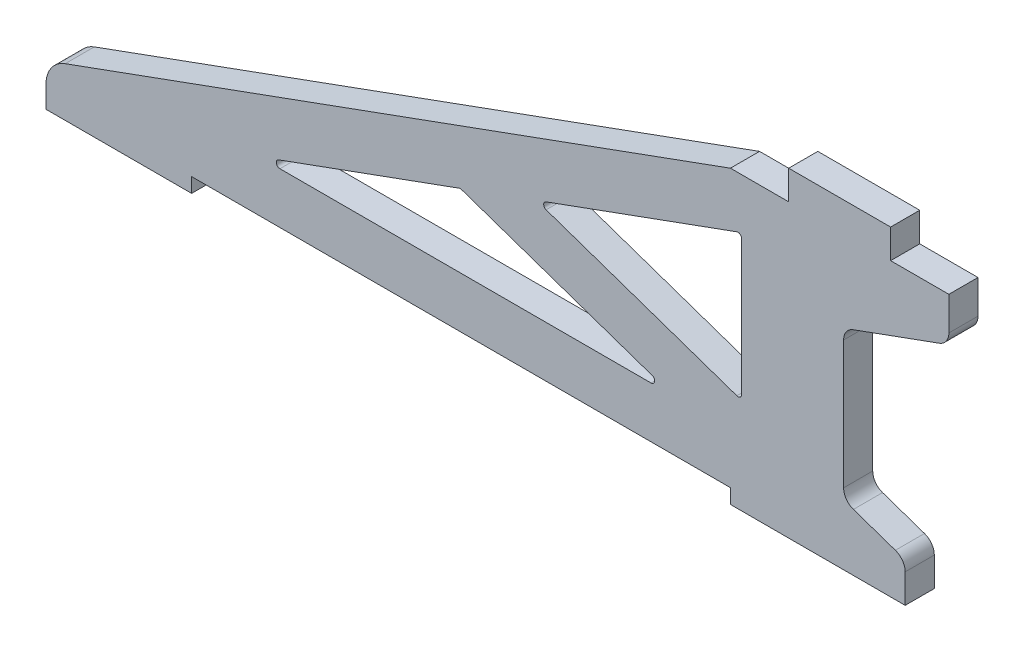
ISO-10303-21;
HEADER;
FILE_DESCRIPTION(('STEP AP214'),'2;1');
FILE_NAME('part.step','',(''),(''),'','','');
FILE_SCHEMA(('AUTOMOTIVE_DESIGN { 1 0 10303 214 1 1 1 1 }'));
ENDSEC;
DATA;
#1=APPLICATION_CONTEXT('core data for automotive mechanical design processes');
#2=APPLICATION_PROTOCOL_DEFINITION('international standard','automotive_design',2000,#1);
#3=PRODUCT_CONTEXT('',#1,'mechanical');
#4=PRODUCT('Part','Part','',(#3));
#5=PRODUCT_RELATED_PRODUCT_CATEGORY('part','',(#4));
#6=PRODUCT_DEFINITION_FORMATION('','',#4);
#7=PRODUCT_DEFINITION_CONTEXT('part definition',#1,'design');
#8=PRODUCT_DEFINITION('design','',#6,#7);
#9=PRODUCT_DEFINITION_SHAPE('','',#8);
#10=(LENGTH_UNIT() NAMED_UNIT(*) SI_UNIT(.MILLI.,.METRE.));
#11=(NAMED_UNIT(*) PLANE_ANGLE_UNIT() SI_UNIT($,.RADIAN.));
#12=(NAMED_UNIT(*) SI_UNIT($,.STERADIAN.) SOLID_ANGLE_UNIT());
#13=UNCERTAINTY_MEASURE_WITH_UNIT(LENGTH_MEASURE(1.E-05),#10,'distance_accuracy_value','');
#14=(GEOMETRIC_REPRESENTATION_CONTEXT(3) GLOBAL_UNCERTAINTY_ASSIGNED_CONTEXT((#13)) GLOBAL_UNIT_ASSIGNED_CONTEXT((#10,
#11,#12)) REPRESENTATION_CONTEXT('',''));
#15=CARTESIAN_POINT('',(0.,0.,0.));
#16=DIRECTION('',(0.,0.,1.));
#17=DIRECTION('',(1.,0.,0.));
#18=AXIS2_PLACEMENT_3D('',#15,#16,#17);
#19=CARTESIAN_POINT('',(61.,17.7002075382097,2.));
#20=DIRECTION('',(0.,0.,-1.));
#21=DIRECTION('',(-1.,0.,0.));
#22=AXIS2_PLACEMENT_3D('',#19,#20,#21);
#23=PLANE('',#22);
#24=CARTESIAN_POINT('',(47.5209644446334,16.1989489041729,2.));
#25=DIRECTION('',(0.,0.,1.));
#26=DIRECTION('',(1.,0.,0.));
#27=AXIS2_PLACEMENT_3D('',#24,#25,#26);
#28=CIRCLE('',#27,0.250000000000001);
#29=CARTESIAN_POINT('',(47.7709644446334,16.1989489041729,2.));
#30=VERTEX_POINT('',#29);
#31=CARTESIAN_POINT('',(47.435459408802,16.4338720593694,2.));
#32=VERTEX_POINT('',#31);
#33=EDGE_CURVE('E304',#30,#32,#28,.T.);
#34=ORIENTED_EDGE('',*,*,#33,.F.);
#35=DIRECTION('',(0.,1.,0.));
#36=VECTOR('',#35,1.);
#37=CARTESIAN_POINT('',(47.7709644446334,16.1989489041729,2.));
#38=LINE('',#37,#36);
#39=CARTESIAN_POINT('',(47.7709644446334,6.92390154960729,2.));
#40=VERTEX_POINT('',#39);
#41=EDGE_CURVE('E316',#40,#30,#38,.T.);
#42=ORIENTED_EDGE('',*,*,#41,.F.);
#43=CARTESIAN_POINT('',(47.5209644446334,6.92390154960729,2.));
#44=DIRECTION('',(0.,0.,1.));
#45=DIRECTION('',(-1.,0.,0.));
#46=AXIS2_PLACEMENT_3D('',#43,#44,#45);
#47=CIRCLE('',#46,0.249999999999999);
#48=CARTESIAN_POINT('',(47.4395724060191,6.68752190570746,2.));
#49=VERTEX_POINT('',#48);
#50=EDGE_CURVE('E313',#49,#40,#47,.T.);
#51=ORIENTED_EDGE('',*,*,#50,.F.);
#52=DIRECTION('',(0.945518575599319,-0.32556815445715,0.));
#53=VECTOR('',#52,1.);
#54=CARTESIAN_POINT('',(47.4395724060191,6.68752190570746,2.));
#55=LINE('',#54,#53);
#56=CARTESIAN_POINT('',(34.34473188579,11.1964370884466,2.));
#57=VERTEX_POINT('',#56);
#58=EDGE_CURVE('E311',#57,#49,#55,.T.);
#59=ORIENTED_EDGE('',*,*,#58,.F.);
#60=CARTESIAN_POINT('',(34.4261239244043,11.4328167323465,2.));
#61=DIRECTION('',(0.,0.,1.));
#62=DIRECTION('',(-1.,0.,0.));
#63=AXIS2_PLACEMENT_3D('',#60,#61,#62);
#64=CIRCLE('',#63,0.249999999999997);
#65=CARTESIAN_POINT('',(34.3406188885729,11.6677398875429,2.));
#66=VERTEX_POINT('',#65);
#67=EDGE_CURVE('E309',#66,#57,#64,.T.);
#68=ORIENTED_EDGE('',*,*,#67,.F.);
#69=DIRECTION('',(-0.939692620785906,-0.342020143325677,0.));
#70=VECTOR('',#69,1.);
#71=CARTESIAN_POINT('',(34.3406188885729,11.6677398875429,2.));
#72=LINE('',#71,#70);
#73=EDGE_CURVE('E306',#32,#66,#72,.T.);
#74=ORIENTED_EDGE('',*,*,#73,.F.);
#75=EDGE_LOOP('',(#34,#42,#51,#59,#68,#74));
#76=FACE_BOUND('',#75,.T.);
#77=DIRECTION('',(-1.,0.,0.));
#78=VECTOR('',#77,1.);
#79=CARTESIAN_POINT('',(47.,20.,2.));
#80=LINE('',#79,#78);
#81=CARTESIAN_POINT('',(51.,20.,2.));
#82=VERTEX_POINT('',#81);
#83=CARTESIAN_POINT('',(47.,20.,2.));
#84=VERTEX_POINT('',#83);
#85=EDGE_CURVE('E349',#82,#84,#80,.T.);
#86=ORIENTED_EDGE('',*,*,#85,.T.);
#87=DIRECTION('',(-0.939692620785906,-0.342020143325676,0.));
#88=VECTOR('',#87,1.);
#89=CARTESIAN_POINT('',(1.31595971334865,3.37236915464047,2.));
#90=LINE('',#89,#88);
#91=CARTESIAN_POINT('',(1.31595971334865,3.37236915464047,2.));
#92=VERTEX_POINT('',#91);
#93=EDGE_CURVE('E352',#84,#92,#90,.T.);
#94=ORIENTED_EDGE('',*,*,#93,.T.);
#95=CARTESIAN_POINT('',(2.,1.49298391306866,2.));
#96=DIRECTION('',(0.,0.,1.));
#97=DIRECTION('',(1.,0.,0.));
#98=AXIS2_PLACEMENT_3D('',#95,#96,#97);
#99=CIRCLE('',#98,2.);
#100=CARTESIAN_POINT('',(0.,1.49298391306866,2.));
#101=VERTEX_POINT('',#100);
#102=EDGE_CURVE('E355',#92,#101,#99,.T.);
#103=ORIENTED_EDGE('',*,*,#102,.T.);
#104=DIRECTION('',(0.,-1.,0.));
#105=VECTOR('',#104,1.);
#106=CARTESIAN_POINT('',(0.,1.49298391306866,2.));
#107=LINE('',#106,#105);
#108=CARTESIAN_POINT('',(0.,0.,2.));
#109=VERTEX_POINT('',#108);
#110=EDGE_CURVE('E357',#101,#109,#107,.T.);
#111=ORIENTED_EDGE('',*,*,#110,.T.);
#112=DIRECTION('',(1.,0.,0.));
#113=VECTOR('',#112,1.);
#114=CARTESIAN_POINT('',(10.,0.,2.));
#115=LINE('',#114,#113);
#116=CARTESIAN_POINT('',(10.,0.,2.));
#117=VERTEX_POINT('',#116);
#118=EDGE_CURVE('E359',#109,#117,#115,.T.);
#119=ORIENTED_EDGE('',*,*,#118,.T.);
#120=DIRECTION('',(0.,1.,0.));
#121=VECTOR('',#120,1.);
#122=CARTESIAN_POINT('',(10.,1.,2.));
#123=LINE('',#122,#121);
#124=CARTESIAN_POINT('',(10.,1.,2.));
#125=VERTEX_POINT('',#124);
#126=EDGE_CURVE('E361',#117,#125,#123,.T.);
#127=ORIENTED_EDGE('',*,*,#126,.T.);
#128=DIRECTION('',(1.,0.,0.));
#129=VECTOR('',#128,1.);
#130=CARTESIAN_POINT('',(47.,1.00000000000001,2.));
#131=LINE('',#130,#129);
#132=CARTESIAN_POINT('',(47.,1.00000000000001,2.));
#133=VERTEX_POINT('',#132);
#134=EDGE_CURVE('E363',#125,#133,#131,.T.);
#135=ORIENTED_EDGE('',*,*,#134,.T.);
#136=DIRECTION('',(0.,-1.,0.));
#137=VECTOR('',#136,1.);
#138=CARTESIAN_POINT('',(47.,0.,2.));
#139=LINE('',#138,#137);
#140=CARTESIAN_POINT('',(47.,0.,2.));
#141=VERTEX_POINT('',#140);
#142=EDGE_CURVE('E365',#133,#141,#139,.T.);
#143=ORIENTED_EDGE('',*,*,#142,.T.);
#144=DIRECTION('',(1.,0.,0.));
#145=VECTOR('',#144,1.);
#146=CARTESIAN_POINT('',(59.,0.,2.));
#147=LINE('',#146,#145);
#148=CARTESIAN_POINT('',(59.,0.,2.));
#149=VERTEX_POINT('',#148);
#150=EDGE_CURVE('E367',#141,#149,#147,.T.);
#151=ORIENTED_EDGE('',*,*,#150,.T.);
#152=DIRECTION('',(0.,1.,0.));
#153=VECTOR('',#152,1.);
#154=CARTESIAN_POINT('',(59.,1.99365439576711,2.));
#155=LINE('',#154,#153);
#156=CARTESIAN_POINT('',(59.,1.99365439576711,2.));
#157=VERTEX_POINT('',#156);
#158=EDGE_CURVE('E369',#149,#157,#155,.T.);
#159=ORIENTED_EDGE('',*,*,#158,.T.);
#160=CARTESIAN_POINT('',(58.,1.99365439576711,2.));
#161=DIRECTION('',(0.,0.,1.));
#162=DIRECTION('',(-1.,0.,0.));
#163=AXIS2_PLACEMENT_3D('',#160,#161,#162);
#164=CIRCLE('',#163,0.999999999999998);
#165=CARTESIAN_POINT('',(58.3255681544571,2.93917297136643,2.));
#166=VERTEX_POINT('',#165);
#167=EDGE_CURVE('E371',#157,#166,#164,.T.);
#168=ORIENTED_EDGE('',*,*,#167,.T.);
#169=DIRECTION('',(-0.945518575599319,0.325568154457152,0.));
#170=VECTOR('',#169,1.);
#171=CARTESIAN_POINT('',(55.4453962901762,3.9308956752583,2.));
#172=LINE('',#171,#170);
#173=CARTESIAN_POINT('',(55.4453962901762,3.9308956752583,2.));
#174=VERTEX_POINT('',#173);
#175=EDGE_CURVE('E373',#166,#174,#172,.T.);
#176=ORIENTED_EDGE('',*,*,#175,.T.);
#177=CARTESIAN_POINT('',(55.7709644446334,4.87641425085762,2.));
#178=DIRECTION('',(0.,0.,-1.));
#179=DIRECTION('',(1.,0.,0.));
#180=AXIS2_PLACEMENT_3D('',#177,#178,#179);
#181=CIRCLE('',#180,0.999999999999999);
#182=CARTESIAN_POINT('',(54.7709644446334,4.87641425085762,2.));
#183=VERTEX_POINT('',#182);
#184=EDGE_CURVE('E375',#174,#183,#181,.T.);
#185=ORIENTED_EDGE('',*,*,#184,.T.);
#186=DIRECTION('',(0.,1.,0.));
#187=VECTOR('',#186,1.);
#188=CARTESIAN_POINT('',(54.7709644446334,13.6686386971847,2.));
#189=LINE('',#188,#187);
#190=CARTESIAN_POINT('',(54.7709644446334,13.6686386971847,2.));
#191=VERTEX_POINT('',#190);
#192=EDGE_CURVE('E377',#183,#191,#189,.T.);
#193=ORIENTED_EDGE('',*,*,#192,.T.);
#194=CARTESIAN_POINT('',(55.7709644446334,13.6686386971847,2.));
#195=DIRECTION('',(0.,0.,-1.));
#196=DIRECTION('',(1.,0.,0.));
#197=AXIS2_PLACEMENT_3D('',#194,#195,#196);
#198=CIRCLE('',#197,1.);
#199=CARTESIAN_POINT('',(55.4289443013077,14.6083313179707,2.));
#200=VERTEX_POINT('',#199);
#201=EDGE_CURVE('E379',#191,#200,#198,.T.);
#202=ORIENTED_EDGE('',*,*,#201,.T.);
#203=DIRECTION('',(0.939692620785905,0.342020143325677,0.));
#204=VECTOR('',#203,1.);
#205=CARTESIAN_POINT('',(61.3420201433257,16.7605149174238,2.));
#206=LINE('',#205,#204);
#207=CARTESIAN_POINT('',(61.3420201433257,16.7605149174238,2.));
#208=VERTEX_POINT('',#207);
#209=EDGE_CURVE('E381',#200,#208,#206,.T.);
#210=ORIENTED_EDGE('',*,*,#209,.T.);
#211=CARTESIAN_POINT('',(61.,17.7002075382097,2.));
#212=DIRECTION('',(0.,0.,1.));
#213=DIRECTION('',(-1.,0.,0.));
#214=AXIS2_PLACEMENT_3D('',#211,#212,#213);
#215=CIRCLE('',#214,1.);
#216=CARTESIAN_POINT('',(62.,17.7002075382097,2.));
#217=VERTEX_POINT('',#216);
#218=EDGE_CURVE('E383',#208,#217,#215,.T.);
#219=ORIENTED_EDGE('',*,*,#218,.T.);
#220=DIRECTION('',(0.,1.,0.));
#221=VECTOR('',#220,1.);
#222=CARTESIAN_POINT('',(62.,20.,2.));
#223=LINE('',#222,#221);
#224=CARTESIAN_POINT('',(62.,20.,2.));
#225=VERTEX_POINT('',#224);
#226=EDGE_CURVE('E385',#217,#225,#223,.T.);
#227=ORIENTED_EDGE('',*,*,#226,.T.);
#228=DIRECTION('',(-1.,0.,0.));
#229=VECTOR('',#228,1.);
#230=CARTESIAN_POINT('',(58.,20.,2.));
#231=LINE('',#230,#229);
#232=CARTESIAN_POINT('',(58.,20.,2.));
#233=VERTEX_POINT('',#232);
#234=EDGE_CURVE('E387',#225,#233,#231,.T.);
#235=ORIENTED_EDGE('',*,*,#234,.T.);
#236=DIRECTION('',(0.,1.,0.));
#237=VECTOR('',#236,1.);
#238=CARTESIAN_POINT('',(58.,22.,2.));
#239=LINE('',#238,#237);
#240=CARTESIAN_POINT('',(58.,22.,2.));
#241=VERTEX_POINT('',#240);
#242=EDGE_CURVE('E389',#233,#241,#239,.T.);
#243=ORIENTED_EDGE('',*,*,#242,.T.);
#244=DIRECTION('',(-1.,0.,0.));
#245=VECTOR('',#244,1.);
#246=CARTESIAN_POINT('',(51.,22.,2.));
#247=LINE('',#246,#245);
#248=CARTESIAN_POINT('',(51.,22.,2.));
#249=VERTEX_POINT('',#248);
#250=EDGE_CURVE('E391',#241,#249,#247,.T.);
#251=ORIENTED_EDGE('',*,*,#250,.T.);
#252=DIRECTION('',(0.,-1.,0.));
#253=VECTOR('',#252,1.);
#254=CARTESIAN_POINT('',(51.,20.,2.));
#255=LINE('',#254,#253);
#256=EDGE_CURVE('E393',#249,#82,#255,.T.);
#257=ORIENTED_EDGE('',*,*,#256,.T.);
#258=EDGE_LOOP('',(#86,#94,#103,#111,#119,#127,#135,#143,#151,#159,#168,#176,#185,#193,#202,
#210,#219,#227,#235,#243,#251,#257));
#259=FACE_BOUND('',#258,.T.);
#260=CARTESIAN_POINT('',(28.4533785047411,9.25891518273918,2.));
#261=DIRECTION('',(0.,0.,1.));
#262=DIRECTION('',(-1.,0.,0.));
#263=AXIS2_PLACEMENT_3D('',#260,#261,#262);
#264=CIRCLE('',#263,0.249999999999999);
#265=CARTESIAN_POINT('',(28.5347705433553,9.49529482663901,2.));
#266=VERTEX_POINT('',#265);
#267=CARTESIAN_POINT('',(28.3678734689096,9.49383833793565,2.));
#268=VERTEX_POINT('',#267);
#269=EDGE_CURVE('E253',#266,#268,#264,.T.);
#270=ORIENTED_EDGE('',*,*,#269,.F.);
#271=DIRECTION('',(-0.945518575599319,0.32556815445715,0.));
#272=VECTOR('',#271,1.);
#273=CARTESIAN_POINT('',(28.5347705433553,9.49529482663901,2.));
#274=LINE('',#273,#272);
#275=CARTESIAN_POINT('',(41.6296110635844,4.98637964389983,2.));
#276=VERTEX_POINT('',#275);
#277=EDGE_CURVE('E282',#276,#266,#274,.T.);
#278=ORIENTED_EDGE('',*,*,#277,.F.);
#279=CARTESIAN_POINT('',(41.5482190249701,4.75,2.));
#280=DIRECTION('',(0.,0.,1.));
#281=DIRECTION('',(-1.,0.,0.));
#282=AXIS2_PLACEMENT_3D('',#279,#280,#281);
#283=CIRCLE('',#282,0.250000000000002);
#284=CARTESIAN_POINT('',(41.5482190249701,4.5,2.));
#285=VERTEX_POINT('',#284);
#286=EDGE_CURVE('E280',#285,#276,#283,.T.);
#287=ORIENTED_EDGE('',*,*,#286,.F.);
#288=DIRECTION('',(1.,0.,0.));
#289=VECTOR('',#288,1.);
#290=CARTESIAN_POINT('',(41.5482190249701,4.5,2.));
#291=LINE('',#290,#289);
#292=CARTESIAN_POINT('',(16.0652358539294,4.5,2.));
#293=VERTEX_POINT('',#292);
#294=EDGE_CURVE('E276',#293,#285,#291,.T.);
#295=ORIENTED_EDGE('',*,*,#294,.F.);
#296=CARTESIAN_POINT('',(16.0652358539294,4.75,2.));
#297=DIRECTION('',(0.,0.,1.));
#298=DIRECTION('',(1.,0.,0.));
#299=AXIS2_PLACEMENT_3D('',#296,#297,#298);
#300=CIRCLE('',#299,0.250000000000001);
#301=CARTESIAN_POINT('',(15.979730818098,4.98492315519648,2.));
#302=VERTEX_POINT('',#301);
#303=EDGE_CURVE('E274',#302,#293,#300,.T.);
#304=ORIENTED_EDGE('',*,*,#303,.F.);
#305=DIRECTION('',(-0.939692620785906,-0.342020143325676,0.));
#306=VECTOR('',#305,1.);
#307=CARTESIAN_POINT('',(15.979730818098,4.98492315519648,2.));
#308=LINE('',#307,#306);
#309=EDGE_CURVE('E261',#268,#302,#308,.T.);
#310=ORIENTED_EDGE('',*,*,#309,.F.);
#311=EDGE_LOOP('',(#270,#278,#287,#295,#304,#310));
#312=FACE_BOUND('',#311,.T.);
#313=ADVANCED_FACE('F32',(#76,#259,#312),#23,.F.);
#314=CARTESIAN_POINT('',(61.,17.7002075382097,0.));
#315=DIRECTION('',(0.,0.,-1.));
#316=DIRECTION('',(-1.,0.,0.));
#317=AXIS2_PLACEMENT_3D('',#314,#315,#316);
#318=PLANE('',#317);
#319=DIRECTION('',(-1.,0.,0.));
#320=VECTOR('',#319,1.);
#321=CARTESIAN_POINT('',(47.,20.,0.));
#322=LINE('',#321,#320);
#323=CARTESIAN_POINT('',(51.,20.,0.));
#324=VERTEX_POINT('',#323);
#325=CARTESIAN_POINT('',(47.,20.,0.));
#326=VERTEX_POINT('',#325);
#327=EDGE_CURVE('E348',#324,#326,#322,.T.);
#328=ORIENTED_EDGE('',*,*,#327,.F.);
#329=DIRECTION('',(0.,-1.,0.));
#330=VECTOR('',#329,1.);
#331=CARTESIAN_POINT('',(51.,20.,0.));
#332=LINE('',#331,#330);
#333=CARTESIAN_POINT('',(51.,22.,0.));
#334=VERTEX_POINT('',#333);
#335=EDGE_CURVE('E353',#334,#324,#332,.T.);
#336=ORIENTED_EDGE('',*,*,#335,.F.);
#337=DIRECTION('',(-1.,0.,0.));
#338=VECTOR('',#337,1.);
#339=CARTESIAN_POINT('',(51.,22.,0.));
#340=LINE('',#339,#338);
#341=CARTESIAN_POINT('',(58.,22.,0.));
#342=VERTEX_POINT('',#341);
#343=EDGE_CURVE('E436',#342,#334,#340,.T.);
#344=ORIENTED_EDGE('',*,*,#343,.F.);
#345=DIRECTION('',(0.,1.,0.));
#346=VECTOR('',#345,1.);
#347=CARTESIAN_POINT('',(58.,22.,0.));
#348=LINE('',#347,#346);
#349=CARTESIAN_POINT('',(58.,20.,0.));
#350=VERTEX_POINT('',#349);
#351=EDGE_CURVE('E434',#350,#342,#348,.T.);
#352=ORIENTED_EDGE('',*,*,#351,.F.);
#353=DIRECTION('',(-1.,0.,0.));
#354=VECTOR('',#353,1.);
#355=CARTESIAN_POINT('',(58.,20.,0.));
#356=LINE('',#355,#354);
#357=CARTESIAN_POINT('',(62.,20.,0.));
#358=VERTEX_POINT('',#357);
#359=EDGE_CURVE('E432',#358,#350,#356,.T.);
#360=ORIENTED_EDGE('',*,*,#359,.F.);
#361=DIRECTION('',(0.,1.,0.));
#362=VECTOR('',#361,1.);
#363=CARTESIAN_POINT('',(62.,20.,0.));
#364=LINE('',#363,#362);
#365=CARTESIAN_POINT('',(62.,17.7002075382097,0.));
#366=VERTEX_POINT('',#365);
#367=EDGE_CURVE('E430',#366,#358,#364,.T.);
#368=ORIENTED_EDGE('',*,*,#367,.F.);
#369=CARTESIAN_POINT('',(61.,17.7002075382097,0.));
#370=DIRECTION('',(0.,0.,1.));
#371=DIRECTION('',(-1.,0.,0.));
#372=AXIS2_PLACEMENT_3D('',#369,#370,#371);
#373=CIRCLE('',#372,1.);
#374=CARTESIAN_POINT('',(61.3420201433257,16.7605149174238,0.));
#375=VERTEX_POINT('',#374);
#376=EDGE_CURVE('E428',#375,#366,#373,.T.);
#377=ORIENTED_EDGE('',*,*,#376,.F.);
#378=DIRECTION('',(0.939692620785905,0.342020143325677,0.));
#379=VECTOR('',#378,1.);
#380=CARTESIAN_POINT('',(61.3420201433257,16.7605149174238,0.));
#381=LINE('',#380,#379);
#382=CARTESIAN_POINT('',(55.4289443013077,14.6083313179707,0.));
#383=VERTEX_POINT('',#382);
#384=EDGE_CURVE('E426',#383,#375,#381,.T.);
#385=ORIENTED_EDGE('',*,*,#384,.F.);
#386=CARTESIAN_POINT('',(55.7709644446334,13.6686386971847,0.));
#387=DIRECTION('',(0.,0.,-1.));
#388=DIRECTION('',(1.,0.,0.));
#389=AXIS2_PLACEMENT_3D('',#386,#387,#388);
#390=CIRCLE('',#389,1.);
#391=CARTESIAN_POINT('',(54.7709644446334,13.6686386971847,0.));
#392=VERTEX_POINT('',#391);
#393=EDGE_CURVE('E424',#392,#383,#390,.T.);
#394=ORIENTED_EDGE('',*,*,#393,.F.);
#395=DIRECTION('',(0.,1.,0.));
#396=VECTOR('',#395,1.);
#397=CARTESIAN_POINT('',(54.7709644446334,13.6686386971847,0.));
#398=LINE('',#397,#396);
#399=CARTESIAN_POINT('',(54.7709644446334,4.87641425085762,0.));
#400=VERTEX_POINT('',#399);
#401=EDGE_CURVE('E422',#400,#392,#398,.T.);
#402=ORIENTED_EDGE('',*,*,#401,.F.);
#403=CARTESIAN_POINT('',(55.7709644446334,4.87641425085762,0.));
#404=DIRECTION('',(0.,0.,-1.));
#405=DIRECTION('',(1.,0.,0.));
#406=AXIS2_PLACEMENT_3D('',#403,#404,#405);
#407=CIRCLE('',#406,0.999999999999999);
#408=CARTESIAN_POINT('',(55.4453962901762,3.9308956752583,0.));
#409=VERTEX_POINT('',#408);
#410=EDGE_CURVE('E420',#409,#400,#407,.T.);
#411=ORIENTED_EDGE('',*,*,#410,.F.);
#412=DIRECTION('',(-0.945518575599319,0.325568154457152,0.));
#413=VECTOR('',#412,1.);
#414=CARTESIAN_POINT('',(55.4453962901762,3.9308956752583,0.));
#415=LINE('',#414,#413);
#416=CARTESIAN_POINT('',(58.3255681544571,2.93917297136643,0.));
#417=VERTEX_POINT('',#416);
#418=EDGE_CURVE('E418',#417,#409,#415,.T.);
#419=ORIENTED_EDGE('',*,*,#418,.F.);
#420=CARTESIAN_POINT('',(58.,1.99365439576711,0.));
#421=DIRECTION('',(0.,0.,1.));
#422=DIRECTION('',(-1.,0.,0.));
#423=AXIS2_PLACEMENT_3D('',#420,#421,#422);
#424=CIRCLE('',#423,0.999999999999998);
#425=CARTESIAN_POINT('',(59.,1.99365439576711,0.));
#426=VERTEX_POINT('',#425);
#427=EDGE_CURVE('E416',#426,#417,#424,.T.);
#428=ORIENTED_EDGE('',*,*,#427,.F.);
#429=DIRECTION('',(0.,1.,0.));
#430=VECTOR('',#429,1.);
#431=CARTESIAN_POINT('',(59.,1.99365439576711,0.));
#432=LINE('',#431,#430);
#433=CARTESIAN_POINT('',(59.,0.,0.));
#434=VERTEX_POINT('',#433);
#435=EDGE_CURVE('E414',#434,#426,#432,.T.);
#436=ORIENTED_EDGE('',*,*,#435,.F.);
#437=DIRECTION('',(1.,0.,0.));
#438=VECTOR('',#437,1.);
#439=CARTESIAN_POINT('',(59.,0.,0.));
#440=LINE('',#439,#438);
#441=CARTESIAN_POINT('',(47.,0.,0.));
#442=VERTEX_POINT('',#441);
#443=EDGE_CURVE('E412',#442,#434,#440,.T.);
#444=ORIENTED_EDGE('',*,*,#443,.F.);
#445=DIRECTION('',(0.,-1.,0.));
#446=VECTOR('',#445,1.);
#447=CARTESIAN_POINT('',(47.,0.,0.));
#448=LINE('',#447,#446);
#449=CARTESIAN_POINT('',(47.,1.00000000000001,0.));
#450=VERTEX_POINT('',#449);
#451=EDGE_CURVE('E410',#450,#442,#448,.T.);
#452=ORIENTED_EDGE('',*,*,#451,.F.);
#453=DIRECTION('',(1.,0.,0.));
#454=VECTOR('',#453,1.);
#455=CARTESIAN_POINT('',(47.,1.00000000000001,0.));
#456=LINE('',#455,#454);
#457=CARTESIAN_POINT('',(10.,1.,0.));
#458=VERTEX_POINT('',#457);
#459=EDGE_CURVE('E408',#458,#450,#456,.T.);
#460=ORIENTED_EDGE('',*,*,#459,.F.);
#461=DIRECTION('',(0.,1.,0.));
#462=VECTOR('',#461,1.);
#463=CARTESIAN_POINT('',(10.,1.,0.));
#464=LINE('',#463,#462);
#465=CARTESIAN_POINT('',(10.,0.,0.));
#466=VERTEX_POINT('',#465);
#467=EDGE_CURVE('E406',#466,#458,#464,.T.);
#468=ORIENTED_EDGE('',*,*,#467,.F.);
#469=DIRECTION('',(1.,0.,0.));
#470=VECTOR('',#469,1.);
#471=CARTESIAN_POINT('',(10.,0.,0.));
#472=LINE('',#471,#470);
#473=CARTESIAN_POINT('',(0.,0.,0.));
#474=VERTEX_POINT('',#473);
#475=EDGE_CURVE('E404',#474,#466,#472,.T.);
#476=ORIENTED_EDGE('',*,*,#475,.F.);
#477=DIRECTION('',(0.,-1.,0.));
#478=VECTOR('',#477,1.);
#479=CARTESIAN_POINT('',(0.,1.49298391306866,0.));
#480=LINE('',#479,#478);
#481=CARTESIAN_POINT('',(0.,1.49298391306866,0.));
#482=VERTEX_POINT('',#481);
#483=EDGE_CURVE('E402',#482,#474,#480,.T.);
#484=ORIENTED_EDGE('',*,*,#483,.F.);
#485=CARTESIAN_POINT('',(2.,1.49298391306866,0.));
#486=DIRECTION('',(0.,0.,1.));
#487=DIRECTION('',(1.,0.,0.));
#488=AXIS2_PLACEMENT_3D('',#485,#486,#487);
#489=CIRCLE('',#488,2.);
#490=CARTESIAN_POINT('',(1.31595971334865,3.37236915464047,0.));
#491=VERTEX_POINT('',#490);
#492=EDGE_CURVE('E400',#491,#482,#489,.T.);
#493=ORIENTED_EDGE('',*,*,#492,.F.);
#494=DIRECTION('',(-0.939692620785906,-0.342020143325676,0.));
#495=VECTOR('',#494,1.);
#496=CARTESIAN_POINT('',(1.31595971334865,3.37236915464047,0.));
#497=LINE('',#496,#495);
#498=EDGE_CURVE('E398',#326,#491,#497,.T.);
#499=ORIENTED_EDGE('',*,*,#498,.F.);
#500=EDGE_LOOP('',(#328,#336,#344,#352,#360,#368,#377,#385,#394,#402,#411,#419,#428,#436,#444,
#452,#460,#468,#476,#484,#493,#499));
#501=FACE_BOUND('',#500,.T.);
#502=DIRECTION('',(0.,1.,0.));
#503=VECTOR('',#502,1.);
#504=CARTESIAN_POINT('',(47.7709644446334,16.1989489041729,0.));
#505=LINE('',#504,#503);
#506=CARTESIAN_POINT('',(47.7709644446334,6.92390154960729,0.));
#507=VERTEX_POINT('',#506);
#508=CARTESIAN_POINT('',(47.7709644446334,16.1989489041729,0.));
#509=VERTEX_POINT('',#508);
#510=EDGE_CURVE('E307',#507,#509,#505,.T.);
#511=ORIENTED_EDGE('',*,*,#510,.T.);
#512=CARTESIAN_POINT('',(47.5209644446334,16.1989489041729,0.));
#513=DIRECTION('',(0.,0.,1.));
#514=DIRECTION('',(1.,0.,0.));
#515=AXIS2_PLACEMENT_3D('',#512,#513,#514);
#516=CIRCLE('',#515,0.250000000000001);
#517=CARTESIAN_POINT('',(47.435459408802,16.4338720593694,0.));
#518=VERTEX_POINT('',#517);
#519=EDGE_CURVE('E269',#509,#518,#516,.T.);
#520=ORIENTED_EDGE('',*,*,#519,.T.);
#521=DIRECTION('',(-0.939692620785906,-0.342020143325677,0.));
#522=VECTOR('',#521,1.);
#523=CARTESIAN_POINT('',(34.3406188885729,11.6677398875429,0.));
#524=LINE('',#523,#522);
#525=CARTESIAN_POINT('',(34.3406188885729,11.6677398875429,0.));
#526=VERTEX_POINT('',#525);
#527=EDGE_CURVE('E321',#518,#526,#524,.T.);
#528=ORIENTED_EDGE('',*,*,#527,.T.);
#529=CARTESIAN_POINT('',(34.4261239244043,11.4328167323465,0.));
#530=DIRECTION('',(0.,0.,1.));
#531=DIRECTION('',(-1.,0.,0.));
#532=AXIS2_PLACEMENT_3D('',#529,#530,#531);
#533=CIRCLE('',#532,0.249999999999997);
#534=CARTESIAN_POINT('',(34.34473188579,11.1964370884466,0.));
#535=VERTEX_POINT('',#534);
#536=EDGE_CURVE('E324',#526,#535,#533,.T.);
#537=ORIENTED_EDGE('',*,*,#536,.T.);
#538=DIRECTION('',(0.945518575599319,-0.32556815445715,0.));
#539=VECTOR('',#538,1.);
#540=CARTESIAN_POINT('',(47.4395724060191,6.68752190570746,0.));
#541=LINE('',#540,#539);
#542=CARTESIAN_POINT('',(47.4395724060191,6.68752190570746,0.));
#543=VERTEX_POINT('',#542);
#544=EDGE_CURVE('E327',#535,#543,#541,.T.);
#545=ORIENTED_EDGE('',*,*,#544,.T.);
#546=CARTESIAN_POINT('',(47.5209644446334,6.92390154960729,0.));
#547=DIRECTION('',(0.,0.,1.));
#548=DIRECTION('',(-1.,0.,0.));
#549=AXIS2_PLACEMENT_3D('',#546,#547,#548);
#550=CIRCLE('',#549,0.249999999999999);
#551=EDGE_CURVE('E330',#543,#507,#550,.T.);
#552=ORIENTED_EDGE('',*,*,#551,.T.);
#553=EDGE_LOOP('',(#511,#520,#528,#537,#545,#552));
#554=FACE_BOUND('',#553,.T.);
#555=DIRECTION('',(-0.945518575599319,0.32556815445715,0.));
#556=VECTOR('',#555,1.);
#557=CARTESIAN_POINT('',(28.5347705433553,9.49529482663901,0.));
#558=LINE('',#557,#556);
#559=CARTESIAN_POINT('',(41.6296110635844,4.98637964389983,0.));
#560=VERTEX_POINT('',#559);
#561=CARTESIAN_POINT('',(28.5347705433553,9.49529482663901,0.));
#562=VERTEX_POINT('',#561);
#563=EDGE_CURVE('E262',#560,#562,#558,.T.);
#564=ORIENTED_EDGE('',*,*,#563,.T.);
#565=CARTESIAN_POINT('',(28.4533785047411,9.25891518273918,0.));
#566=DIRECTION('',(0.,0.,1.));
#567=DIRECTION('',(-1.,0.,0.));
#568=AXIS2_PLACEMENT_3D('',#565,#566,#567);
#569=CIRCLE('',#568,0.249999999999999);
#570=CARTESIAN_POINT('',(28.3678734689096,9.49383833793565,0.));
#571=VERTEX_POINT('',#570);
#572=EDGE_CURVE('E55',#562,#571,#569,.T.);
#573=ORIENTED_EDGE('',*,*,#572,.T.);
#574=DIRECTION('',(-0.939692620785906,-0.342020143325676,0.));
#575=VECTOR('',#574,1.);
#576=CARTESIAN_POINT('',(15.979730818098,4.98492315519648,0.));
#577=LINE('',#576,#575);
#578=CARTESIAN_POINT('',(15.979730818098,4.98492315519648,0.));
#579=VERTEX_POINT('',#578);
#580=EDGE_CURVE('E268',#571,#579,#577,.T.);
#581=ORIENTED_EDGE('',*,*,#580,.T.);
#582=CARTESIAN_POINT('',(16.0652358539294,4.75,0.));
#583=DIRECTION('',(0.,0.,1.));
#584=DIRECTION('',(1.,0.,0.));
#585=AXIS2_PLACEMENT_3D('',#582,#583,#584);
#586=CIRCLE('',#585,0.250000000000001);
#587=CARTESIAN_POINT('',(16.0652358539294,4.5,0.));
#588=VERTEX_POINT('',#587);
#589=EDGE_CURVE('E286',#579,#588,#586,.T.);
#590=ORIENTED_EDGE('',*,*,#589,.T.);
#591=DIRECTION('',(1.,0.,0.));
#592=VECTOR('',#591,1.);
#593=CARTESIAN_POINT('',(41.5482190249701,4.5,0.));
#594=LINE('',#593,#592);
#595=CARTESIAN_POINT('',(41.5482190249701,4.5,0.));
#596=VERTEX_POINT('',#595);
#597=EDGE_CURVE('E289',#588,#596,#594,.T.);
#598=ORIENTED_EDGE('',*,*,#597,.T.);
#599=CARTESIAN_POINT('',(41.5482190249701,4.75,0.));
#600=DIRECTION('',(0.,0.,1.));
#601=DIRECTION('',(-1.,0.,0.));
#602=AXIS2_PLACEMENT_3D('',#599,#600,#601);
#603=CIRCLE('',#602,0.250000000000002);
#604=EDGE_CURVE('E292',#596,#560,#603,.T.);
#605=ORIENTED_EDGE('',*,*,#604,.T.);
#606=EDGE_LOOP('',(#564,#573,#581,#590,#598,#605));
#607=FACE_BOUND('',#606,.T.);
#608=ADVANCED_FACE('F508',(#501,#554,#607),#318,.T.);
#609=CARTESIAN_POINT('',(47.,20.,2.));
#610=DIRECTION('',(0.,-1.,0.));
#611=DIRECTION('',(0.,0.,-1.));
#612=AXIS2_PLACEMENT_3D('',#609,#610,#611);
#613=PLANE('',#612);
#614=ORIENTED_EDGE('',*,*,#327,.T.);
#615=DIRECTION('',(0.,0.,-1.));
#616=VECTOR('',#615,1.);
#617=CARTESIAN_POINT('',(47.,20.,2.));
#618=LINE('',#617,#616);
#619=EDGE_CURVE('E11',#84,#326,#618,.T.);
#620=ORIENTED_EDGE('',*,*,#619,.F.);
#621=ORIENTED_EDGE('',*,*,#85,.F.);
#622=DIRECTION('',(0.,0.,-1.));
#623=VECTOR('',#622,1.);
#624=CARTESIAN_POINT('',(51.,20.,2.));
#625=LINE('',#624,#623);
#626=EDGE_CURVE('E395',#82,#324,#625,.T.);
#627=ORIENTED_EDGE('',*,*,#626,.T.);
#628=EDGE_LOOP('',(#614,#620,#621,#627));
#629=FACE_BOUND('',#628,.T.);
#630=ADVANCED_FACE('F34',(#629),#613,.F.);
#631=CARTESIAN_POINT('',(1.31595971334865,3.37236915464047,2.));
#632=DIRECTION('',(0.342020143325676,-0.939692620785906,0.));
#633=DIRECTION('',(0.939692620785906,0.342020143325677,0.));
#634=AXIS2_PLACEMENT_3D('',#631,#632,#633);
#635=PLANE('',#634);
#636=ORIENTED_EDGE('',*,*,#498,.T.);
#637=DIRECTION('',(0.,0.,-1.));
#638=VECTOR('',#637,1.);
#639=CARTESIAN_POINT('',(1.31595971334865,3.37236915464047,2.));
#640=LINE('',#639,#638);
#641=EDGE_CURVE('E40',#92,#491,#640,.T.);
#642=ORIENTED_EDGE('',*,*,#641,.F.);
#643=ORIENTED_EDGE('',*,*,#93,.F.);
#644=ORIENTED_EDGE('',*,*,#619,.T.);
#645=EDGE_LOOP('',(#636,#642,#643,#644));
#646=FACE_BOUND('',#645,.T.);
#647=ADVANCED_FACE('F525',(#646),#635,.F.);
#648=CARTESIAN_POINT('',(2.,1.49298391306866,2.));
#649=DIRECTION('',(0.,0.,-1.));
#650=DIRECTION('',(-1.,0.,0.));
#651=AXIS2_PLACEMENT_3D('',#648,#649,#650);
#652=CYLINDRICAL_SURFACE('',#651,2.);
#653=ORIENTED_EDGE('',*,*,#492,.T.);
#654=DIRECTION('',(0.,0.,-1.));
#655=VECTOR('',#654,1.);
#656=CARTESIAN_POINT('',(0.,1.49298391306866,2.));
#657=LINE('',#656,#655);
#658=EDGE_CURVE('E495',#101,#482,#657,.T.);
#659=ORIENTED_EDGE('',*,*,#658,.F.);
#660=ORIENTED_EDGE('',*,*,#102,.F.);
#661=ORIENTED_EDGE('',*,*,#641,.T.);
#662=EDGE_LOOP('',(#653,#659,#660,#661));
#663=FACE_BOUND('',#662,.T.);
#664=ADVANCED_FACE('F502',(#663),#652,.T.);
#665=CARTESIAN_POINT('',(0.,1.49298391306866,2.));
#666=DIRECTION('',(1.,0.,0.));
#667=DIRECTION('',(0.,1.,0.));
#668=AXIS2_PLACEMENT_3D('',#665,#666,#667);
#669=PLANE('',#668);
#670=ORIENTED_EDGE('',*,*,#483,.T.);
#671=DIRECTION('',(0.,0.,-1.));
#672=VECTOR('',#671,1.);
#673=CARTESIAN_POINT('',(0.,0.,2.));
#674=LINE('',#673,#672);
#675=EDGE_CURVE('E492',#109,#474,#674,.T.);
#676=ORIENTED_EDGE('',*,*,#675,.F.);
#677=ORIENTED_EDGE('',*,*,#110,.F.);
#678=ORIENTED_EDGE('',*,*,#658,.T.);
#679=EDGE_LOOP('',(#670,#676,#677,#678));
#680=FACE_BOUND('',#679,.T.);
#681=ADVANCED_FACE('F514',(#680),#669,.F.);
#682=CARTESIAN_POINT('',(10.,0.,2.));
#683=DIRECTION('',(0.,1.,0.));
#684=DIRECTION('',(-1.,0.,0.));
#685=AXIS2_PLACEMENT_3D('',#682,#683,#684);
#686=PLANE('',#685);
#687=ORIENTED_EDGE('',*,*,#475,.T.);
#688=DIRECTION('',(0.,0.,-1.));
#689=VECTOR('',#688,1.);
#690=CARTESIAN_POINT('',(10.,0.,2.));
#691=LINE('',#690,#689);
#692=EDGE_CURVE('E489',#117,#466,#691,.T.);
#693=ORIENTED_EDGE('',*,*,#692,.F.);
#694=ORIENTED_EDGE('',*,*,#118,.F.);
#695=ORIENTED_EDGE('',*,*,#675,.T.);
#696=EDGE_LOOP('',(#687,#693,#694,#695));
#697=FACE_BOUND('',#696,.T.);
#698=ADVANCED_FACE('F518',(#697),#686,.F.);
#699=CARTESIAN_POINT('',(10.,1.,2.));
#700=DIRECTION('',(-1.,0.,0.));
#701=DIRECTION('',(0.,0.,1.));
#702=AXIS2_PLACEMENT_3D('',#699,#700,#701);
#703=PLANE('',#702);
#704=ORIENTED_EDGE('',*,*,#467,.T.);
#705=DIRECTION('',(0.,0.,-1.));
#706=VECTOR('',#705,1.);
#707=CARTESIAN_POINT('',(10.,1.,2.));
#708=LINE('',#707,#706);
#709=EDGE_CURVE('E486',#125,#458,#708,.T.);
#710=ORIENTED_EDGE('',*,*,#709,.F.);
#711=ORIENTED_EDGE('',*,*,#126,.F.);
#712=ORIENTED_EDGE('',*,*,#692,.T.);
#713=EDGE_LOOP('',(#704,#710,#711,#712));
#714=FACE_BOUND('',#713,.T.);
#715=ADVANCED_FACE('F608',(#714),#703,.F.);
#716=CARTESIAN_POINT('',(47.,1.00000000000001,2.));
#717=DIRECTION('',(0.,1.,0.));
#718=DIRECTION('',(-1.,0.,0.));
#719=AXIS2_PLACEMENT_3D('',#716,#717,#718);
#720=PLANE('',#719);
#721=ORIENTED_EDGE('',*,*,#459,.T.);
#722=DIRECTION('',(0.,0.,-1.));
#723=VECTOR('',#722,1.);
#724=CARTESIAN_POINT('',(47.,1.00000000000001,2.));
#725=LINE('',#724,#723);
#726=EDGE_CURVE('E483',#133,#450,#725,.T.);
#727=ORIENTED_EDGE('',*,*,#726,.F.);
#728=ORIENTED_EDGE('',*,*,#134,.F.);
#729=ORIENTED_EDGE('',*,*,#709,.T.);
#730=EDGE_LOOP('',(#721,#727,#728,#729));
#731=FACE_BOUND('',#730,.T.);
#732=ADVANCED_FACE('F605',(#731),#720,.F.);
#733=CARTESIAN_POINT('',(47.,0.,2.));
#734=DIRECTION('',(1.,0.,0.));
#735=DIRECTION('',(0.,0.,-1.));
#736=AXIS2_PLACEMENT_3D('',#733,#734,#735);
#737=PLANE('',#736);
#738=ORIENTED_EDGE('',*,*,#451,.T.);
#739=DIRECTION('',(0.,0.,-1.));
#740=VECTOR('',#739,1.);
#741=CARTESIAN_POINT('',(47.,0.,2.));
#742=LINE('',#741,#740);
#743=EDGE_CURVE('E480',#141,#442,#742,.T.);
#744=ORIENTED_EDGE('',*,*,#743,.F.);
#745=ORIENTED_EDGE('',*,*,#142,.F.);
#746=ORIENTED_EDGE('',*,*,#726,.T.);
#747=EDGE_LOOP('',(#738,#744,#745,#746));
#748=FACE_BOUND('',#747,.T.);
#749=ADVANCED_FACE('F601',(#748),#737,.F.);
#750=CARTESIAN_POINT('',(59.,0.,2.));
#751=DIRECTION('',(0.,1.,0.));
#752=DIRECTION('',(-1.,0.,0.));
#753=AXIS2_PLACEMENT_3D('',#750,#751,#752);
#754=PLANE('',#753);
#755=ORIENTED_EDGE('',*,*,#443,.T.);
#756=DIRECTION('',(0.,0.,-1.));
#757=VECTOR('',#756,1.);
#758=CARTESIAN_POINT('',(59.,0.,2.));
#759=LINE('',#758,#757);
#760=EDGE_CURVE('E477',#149,#434,#759,.T.);
#761=ORIENTED_EDGE('',*,*,#760,.F.);
#762=ORIENTED_EDGE('',*,*,#150,.F.);
#763=ORIENTED_EDGE('',*,*,#743,.T.);
#764=EDGE_LOOP('',(#755,#761,#762,#763));
#765=FACE_BOUND('',#764,.T.);
#766=ADVANCED_FACE('F597',(#765),#754,.F.);
#767=CARTESIAN_POINT('',(59.,1.99365439576711,2.));
#768=DIRECTION('',(-1.,0.,0.));
#769=DIRECTION('',(0.,0.,1.));
#770=AXIS2_PLACEMENT_3D('',#767,#768,#769);
#771=PLANE('',#770);
#772=ORIENTED_EDGE('',*,*,#435,.T.);
#773=DIRECTION('',(0.,0.,-1.));
#774=VECTOR('',#773,1.);
#775=CARTESIAN_POINT('',(59.,1.99365439576711,2.));
#776=LINE('',#775,#774);
#777=EDGE_CURVE('E474',#157,#426,#776,.T.);
#778=ORIENTED_EDGE('',*,*,#777,.F.);
#779=ORIENTED_EDGE('',*,*,#158,.F.);
#780=ORIENTED_EDGE('',*,*,#760,.T.);
#781=EDGE_LOOP('',(#772,#778,#779,#780));
#782=FACE_BOUND('',#781,.T.);
#783=ADVANCED_FACE('F592',(#782),#771,.F.);
#784=CARTESIAN_POINT('',(58.,1.99365439576711,2.));
#785=DIRECTION('',(0.,0.,-1.));
#786=DIRECTION('',(-1.,0.,0.));
#787=AXIS2_PLACEMENT_3D('',#784,#785,#786);
#788=CYLINDRICAL_SURFACE('',#787,0.999999999999998);
#789=ORIENTED_EDGE('',*,*,#427,.T.);
#790=DIRECTION('',(0.,0.,-1.));
#791=VECTOR('',#790,1.);
#792=CARTESIAN_POINT('',(58.3255681544571,2.93917297136643,2.));
#793=LINE('',#792,#791);
#794=EDGE_CURVE('E471',#166,#417,#793,.T.);
#795=ORIENTED_EDGE('',*,*,#794,.F.);
#796=ORIENTED_EDGE('',*,*,#167,.F.);
#797=ORIENTED_EDGE('',*,*,#777,.T.);
#798=EDGE_LOOP('',(#789,#795,#796,#797));
#799=FACE_BOUND('',#798,.T.);
#800=ADVANCED_FACE('F586',(#799),#788,.T.);
#801=CARTESIAN_POINT('',(55.4453962901762,3.9308956752583,2.));
#802=DIRECTION('',(-0.325568154457152,-0.945518575599319,0.));
#803=DIRECTION('',(0.945518575599319,-0.325568154457152,0.));
#804=AXIS2_PLACEMENT_3D('',#801,#802,#803);
#805=PLANE('',#804);
#806=ORIENTED_EDGE('',*,*,#418,.T.);
#807=DIRECTION('',(0.,0.,-1.));
#808=VECTOR('',#807,1.);
#809=CARTESIAN_POINT('',(55.4453962901762,3.9308956752583,2.));
#810=LINE('',#809,#808);
#811=EDGE_CURVE('E468',#174,#409,#810,.T.);
#812=ORIENTED_EDGE('',*,*,#811,.F.);
#813=ORIENTED_EDGE('',*,*,#175,.F.);
#814=ORIENTED_EDGE('',*,*,#794,.T.);
#815=EDGE_LOOP('',(#806,#812,#813,#814));
#816=FACE_BOUND('',#815,.T.);
#817=ADVANCED_FACE('F582',(#816),#805,.F.);
#818=CARTESIAN_POINT('',(55.7709644446334,4.87641425085762,2.));
#819=DIRECTION('',(0.,0.,-1.));
#820=DIRECTION('',(-1.,0.,0.));
#821=AXIS2_PLACEMENT_3D('',#818,#819,#820);
#822=CYLINDRICAL_SURFACE('',#821,0.999999999999999);
#823=ORIENTED_EDGE('',*,*,#410,.T.);
#824=DIRECTION('',(0.,0.,-1.));
#825=VECTOR('',#824,1.);
#826=CARTESIAN_POINT('',(54.7709644446334,4.87641425085762,2.));
#827=LINE('',#826,#825);
#828=EDGE_CURVE('E465',#183,#400,#827,.T.);
#829=ORIENTED_EDGE('',*,*,#828,.F.);
#830=ORIENTED_EDGE('',*,*,#184,.F.);
#831=ORIENTED_EDGE('',*,*,#811,.T.);
#832=EDGE_LOOP('',(#823,#829,#830,#831));
#833=FACE_BOUND('',#832,.T.);
#834=ADVANCED_FACE('F577',(#833),#822,.F.);
#835=CARTESIAN_POINT('',(54.7709644446334,13.6686386971847,2.));
#836=DIRECTION('',(-1.,0.,0.));
#837=DIRECTION('',(0.,0.,1.));
#838=AXIS2_PLACEMENT_3D('',#835,#836,#837);
#839=PLANE('',#838);
#840=ORIENTED_EDGE('',*,*,#401,.T.);
#841=DIRECTION('',(0.,0.,-1.));
#842=VECTOR('',#841,1.);
#843=CARTESIAN_POINT('',(54.7709644446334,13.6686386971847,2.));
#844=LINE('',#843,#842);
#845=EDGE_CURVE('E462',#191,#392,#844,.T.);
#846=ORIENTED_EDGE('',*,*,#845,.F.);
#847=ORIENTED_EDGE('',*,*,#192,.F.);
#848=ORIENTED_EDGE('',*,*,#828,.T.);
#849=EDGE_LOOP('',(#840,#846,#847,#848));
#850=FACE_BOUND('',#849,.T.);
#851=ADVANCED_FACE('F571',(#850),#839,.F.);
#852=CARTESIAN_POINT('',(55.7709644446334,13.6686386971847,2.));
#853=DIRECTION('',(0.,0.,-1.));
#854=DIRECTION('',(-1.,0.,0.));
#855=AXIS2_PLACEMENT_3D('',#852,#853,#854);
#856=CYLINDRICAL_SURFACE('',#855,1.);
#857=ORIENTED_EDGE('',*,*,#393,.T.);
#858=DIRECTION('',(0.,0.,-1.));
#859=VECTOR('',#858,1.);
#860=CARTESIAN_POINT('',(55.4289443013077,14.6083313179707,2.));
#861=LINE('',#860,#859);
#862=EDGE_CURVE('E459',#200,#383,#861,.T.);
#863=ORIENTED_EDGE('',*,*,#862,.F.);
#864=ORIENTED_EDGE('',*,*,#201,.F.);
#865=ORIENTED_EDGE('',*,*,#845,.T.);
#866=EDGE_LOOP('',(#857,#863,#864,#865));
#867=FACE_BOUND('',#866,.T.);
#868=ADVANCED_FACE('F567',(#867),#856,.F.);
#869=CARTESIAN_POINT('',(61.3420201433257,16.7605149174238,2.));
#870=DIRECTION('',(-0.342020143325677,0.939692620785905,0.));
#871=DIRECTION('',(-0.939692620785905,-0.342020143325677,0.));
#872=AXIS2_PLACEMENT_3D('',#869,#870,#871);
#873=PLANE('',#872);
#874=ORIENTED_EDGE('',*,*,#384,.T.);
#875=DIRECTION('',(0.,0.,-1.));
#876=VECTOR('',#875,1.);
#877=CARTESIAN_POINT('',(61.3420201433257,16.7605149174238,2.));
#878=LINE('',#877,#876);
#879=EDGE_CURVE('E456',#208,#375,#878,.T.);
#880=ORIENTED_EDGE('',*,*,#879,.F.);
#881=ORIENTED_EDGE('',*,*,#209,.F.);
#882=ORIENTED_EDGE('',*,*,#862,.T.);
#883=EDGE_LOOP('',(#874,#880,#881,#882));
#884=FACE_BOUND('',#883,.T.);
#885=ADVANCED_FACE('F562',(#884),#873,.F.);
#886=CARTESIAN_POINT('',(61.,17.7002075382097,2.));
#887=DIRECTION('',(0.,0.,-1.));
#888=DIRECTION('',(-1.,0.,0.));
#889=AXIS2_PLACEMENT_3D('',#886,#887,#888);
#890=CYLINDRICAL_SURFACE('',#889,1.);
#891=ORIENTED_EDGE('',*,*,#376,.T.);
#892=DIRECTION('',(0.,0.,-1.));
#893=VECTOR('',#892,1.);
#894=CARTESIAN_POINT('',(62.,17.7002075382097,2.));
#895=LINE('',#894,#893);
#896=EDGE_CURVE('E453',#217,#366,#895,.T.);
#897=ORIENTED_EDGE('',*,*,#896,.F.);
#898=ORIENTED_EDGE('',*,*,#218,.F.);
#899=ORIENTED_EDGE('',*,*,#879,.T.);
#900=EDGE_LOOP('',(#891,#897,#898,#899));
#901=FACE_BOUND('',#900,.T.);
#902=ADVANCED_FACE('F556',(#901),#890,.T.);
#903=CARTESIAN_POINT('',(62.,20.,2.));
#904=DIRECTION('',(-1.,0.,0.));
#905=DIRECTION('',(0.,0.,1.));
#906=AXIS2_PLACEMENT_3D('',#903,#904,#905);
#907=PLANE('',#906);
#908=ORIENTED_EDGE('',*,*,#367,.T.);
#909=DIRECTION('',(0.,0.,-1.));
#910=VECTOR('',#909,1.);
#911=CARTESIAN_POINT('',(62.,20.,2.));
#912=LINE('',#911,#910);
#913=EDGE_CURVE('E450',#225,#358,#912,.T.);
#914=ORIENTED_EDGE('',*,*,#913,.F.);
#915=ORIENTED_EDGE('',*,*,#226,.F.);
#916=ORIENTED_EDGE('',*,*,#896,.T.);
#917=EDGE_LOOP('',(#908,#914,#915,#916));
#918=FACE_BOUND('',#917,.T.);
#919=ADVANCED_FACE('F552',(#918),#907,.F.);
#920=CARTESIAN_POINT('',(58.,20.,2.));
#921=DIRECTION('',(0.,-1.,0.));
#922=DIRECTION('',(1.,0.,0.));
#923=AXIS2_PLACEMENT_3D('',#920,#921,#922);
#924=PLANE('',#923);
#925=ORIENTED_EDGE('',*,*,#359,.T.);
#926=DIRECTION('',(0.,0.,-1.));
#927=VECTOR('',#926,1.);
#928=CARTESIAN_POINT('',(58.,20.,2.));
#929=LINE('',#928,#927);
#930=EDGE_CURVE('E447',#233,#350,#929,.T.);
#931=ORIENTED_EDGE('',*,*,#930,.F.);
#932=ORIENTED_EDGE('',*,*,#234,.F.);
#933=ORIENTED_EDGE('',*,*,#913,.T.);
#934=EDGE_LOOP('',(#925,#931,#932,#933));
#935=FACE_BOUND('',#934,.T.);
#936=ADVANCED_FACE('F547',(#935),#924,.F.);
#937=CARTESIAN_POINT('',(58.,22.,2.));
#938=DIRECTION('',(-1.,0.,0.));
#939=DIRECTION('',(0.,0.,1.));
#940=AXIS2_PLACEMENT_3D('',#937,#938,#939);
#941=PLANE('',#940);
#942=ORIENTED_EDGE('',*,*,#351,.T.);
#943=DIRECTION('',(0.,0.,-1.));
#944=VECTOR('',#943,1.);
#945=CARTESIAN_POINT('',(58.,22.,2.));
#946=LINE('',#945,#944);
#947=EDGE_CURVE('E444',#241,#342,#946,.T.);
#948=ORIENTED_EDGE('',*,*,#947,.F.);
#949=ORIENTED_EDGE('',*,*,#242,.F.);
#950=ORIENTED_EDGE('',*,*,#930,.T.);
#951=EDGE_LOOP('',(#942,#948,#949,#950));
#952=FACE_BOUND('',#951,.T.);
#953=ADVANCED_FACE('F541',(#952),#941,.F.);
#954=CARTESIAN_POINT('',(51.,22.,2.));
#955=DIRECTION('',(0.,-1.,0.));
#956=DIRECTION('',(1.,0.,0.));
#957=AXIS2_PLACEMENT_3D('',#954,#955,#956);
#958=PLANE('',#957);
#959=ORIENTED_EDGE('',*,*,#343,.T.);
#960=DIRECTION('',(0.,0.,-1.));
#961=VECTOR('',#960,1.);
#962=CARTESIAN_POINT('',(51.,22.,2.));
#963=LINE('',#962,#961);
#964=EDGE_CURVE('E441',#249,#334,#963,.T.);
#965=ORIENTED_EDGE('',*,*,#964,.F.);
#966=ORIENTED_EDGE('',*,*,#250,.F.);
#967=ORIENTED_EDGE('',*,*,#947,.T.);
#968=EDGE_LOOP('',(#959,#965,#966,#967));
#969=FACE_BOUND('',#968,.T.);
#970=ADVANCED_FACE('F537',(#969),#958,.F.);
#971=CARTESIAN_POINT('',(51.,20.,2.));
#972=DIRECTION('',(1.,0.,0.));
#973=DIRECTION('',(0.,0.,-1.));
#974=AXIS2_PLACEMENT_3D('',#971,#972,#973);
#975=PLANE('',#974);
#976=ORIENTED_EDGE('',*,*,#335,.T.);
#977=ORIENTED_EDGE('',*,*,#626,.F.);
#978=ORIENTED_EDGE('',*,*,#256,.F.);
#979=ORIENTED_EDGE('',*,*,#964,.T.);
#980=EDGE_LOOP('',(#976,#977,#978,#979));
#981=FACE_BOUND('',#980,.T.);
#982=ADVANCED_FACE('F532',(#981),#975,.F.);
#983=CARTESIAN_POINT('',(47.5209644446334,16.1989489041729,2.));
#984=DIRECTION('',(0.,0.,-1.));
#985=DIRECTION('',(-1.,0.,0.));
#986=AXIS2_PLACEMENT_3D('',#983,#984,#985);
#987=CYLINDRICAL_SURFACE('',#986,0.250000000000001);
#988=ORIENTED_EDGE('',*,*,#519,.F.);
#989=DIRECTION('',(0.,0.,-1.));
#990=VECTOR('',#989,1.);
#991=CARTESIAN_POINT('',(47.7709644446334,16.1989489041729,2.));
#992=LINE('',#991,#990);
#993=EDGE_CURVE('E318',#30,#509,#992,.T.);
#994=ORIENTED_EDGE('',*,*,#993,.F.);
#995=ORIENTED_EDGE('',*,*,#33,.T.);
#996=DIRECTION('',(0.,0.,-1.));
#997=VECTOR('',#996,1.);
#998=CARTESIAN_POINT('',(47.435459408802,16.4338720593694,2.));
#999=LINE('',#998,#997);
#1000=EDGE_CURVE('E345',#32,#518,#999,.T.);
#1001=ORIENTED_EDGE('',*,*,#1000,.T.);
#1002=EDGE_LOOP('',(#988,#994,#995,#1001));
#1003=FACE_BOUND('',#1002,.T.);
#1004=ADVANCED_FACE('F626',(#1003),#987,.F.);
#1005=CARTESIAN_POINT('',(34.3406188885729,11.6677398875429,2.));
#1006=DIRECTION('',(0.342020143325677,-0.939692620785906,0.));
#1007=DIRECTION('',(0.939692620785906,0.342020143325677,0.));
#1008=AXIS2_PLACEMENT_3D('',#1005,#1006,#1007);
#1009=PLANE('',#1008);
#1010=ORIENTED_EDGE('',*,*,#527,.F.);
#1011=ORIENTED_EDGE('',*,*,#1000,.F.);
#1012=ORIENTED_EDGE('',*,*,#73,.T.);
#1013=DIRECTION('',(0.,0.,-1.));
#1014=VECTOR('',#1013,1.);
#1015=CARTESIAN_POINT('',(34.3406188885729,11.6677398875429,2.));
#1016=LINE('',#1015,#1014);
#1017=EDGE_CURVE('E343',#66,#526,#1016,.T.);
#1018=ORIENTED_EDGE('',*,*,#1017,.T.);
#1019=EDGE_LOOP('',(#1010,#1011,#1012,#1018));
#1020=FACE_BOUND('',#1019,.T.);
#1021=ADVANCED_FACE('F724',(#1020),#1009,.T.);
#1022=CARTESIAN_POINT('',(34.4261239244043,11.4328167323465,2.));
#1023=DIRECTION('',(0.,0.,-1.));
#1024=DIRECTION('',(-1.,0.,0.));
#1025=AXIS2_PLACEMENT_3D('',#1022,#1023,#1024);
#1026=CYLINDRICAL_SURFACE('',#1025,0.249999999999997);
#1027=ORIENTED_EDGE('',*,*,#536,.F.);
#1028=ORIENTED_EDGE('',*,*,#1017,.F.);
#1029=ORIENTED_EDGE('',*,*,#67,.T.);
#1030=DIRECTION('',(0.,0.,-1.));
#1031=VECTOR('',#1030,1.);
#1032=CARTESIAN_POINT('',(34.34473188579,11.1964370884466,2.));
#1033=LINE('',#1032,#1031);
#1034=EDGE_CURVE('E341',#57,#535,#1033,.T.);
#1035=ORIENTED_EDGE('',*,*,#1034,.T.);
#1036=EDGE_LOOP('',(#1027,#1028,#1029,#1035));
#1037=FACE_BOUND('',#1036,.T.);
#1038=ADVANCED_FACE('F731',(#1037),#1026,.F.);
#1039=CARTESIAN_POINT('',(47.4395724060191,6.68752190570746,2.));
#1040=DIRECTION('',(0.32556815445715,0.945518575599319,0.));
#1041=DIRECTION('',(-0.945518575599319,0.32556815445715,0.));
#1042=AXIS2_PLACEMENT_3D('',#1039,#1040,#1041);
#1043=PLANE('',#1042);
#1044=ORIENTED_EDGE('',*,*,#544,.F.);
#1045=ORIENTED_EDGE('',*,*,#1034,.F.);
#1046=ORIENTED_EDGE('',*,*,#58,.T.);
#1047=DIRECTION('',(0.,0.,-1.));
#1048=VECTOR('',#1047,1.);
#1049=CARTESIAN_POINT('',(47.4395724060191,6.68752190570746,2.));
#1050=LINE('',#1049,#1048);
#1051=EDGE_CURVE('E339',#49,#543,#1050,.T.);
#1052=ORIENTED_EDGE('',*,*,#1051,.T.);
#1053=EDGE_LOOP('',(#1044,#1045,#1046,#1052));
#1054=FACE_BOUND('',#1053,.T.);
#1055=ADVANCED_FACE('F738',(#1054),#1043,.T.);
#1056=CARTESIAN_POINT('',(47.5209644446334,6.92390154960729,2.));
#1057=DIRECTION('',(0.,0.,-1.));
#1058=DIRECTION('',(-1.,0.,0.));
#1059=AXIS2_PLACEMENT_3D('',#1056,#1057,#1058);
#1060=CYLINDRICAL_SURFACE('',#1059,0.249999999999999);
#1061=ORIENTED_EDGE('',*,*,#551,.F.);
#1062=ORIENTED_EDGE('',*,*,#1051,.F.);
#1063=ORIENTED_EDGE('',*,*,#50,.T.);
#1064=DIRECTION('',(0.,0.,-1.));
#1065=VECTOR('',#1064,1.);
#1066=CARTESIAN_POINT('',(47.7709644446334,6.92390154960729,2.));
#1067=LINE('',#1066,#1065);
#1068=EDGE_CURVE('E337',#40,#507,#1067,.T.);
#1069=ORIENTED_EDGE('',*,*,#1068,.T.);
#1070=EDGE_LOOP('',(#1061,#1062,#1063,#1069));
#1071=FACE_BOUND('',#1070,.T.);
#1072=ADVANCED_FACE('F746',(#1071),#1060,.F.);
#1073=CARTESIAN_POINT('',(47.7709644446334,16.1989489041729,2.));
#1074=DIRECTION('',(-1.,0.,0.));
#1075=DIRECTION('',(0.,0.,1.));
#1076=AXIS2_PLACEMENT_3D('',#1073,#1074,#1075);
#1077=PLANE('',#1076);
#1078=ORIENTED_EDGE('',*,*,#510,.F.);
#1079=ORIENTED_EDGE('',*,*,#1068,.F.);
#1080=ORIENTED_EDGE('',*,*,#41,.T.);
#1081=ORIENTED_EDGE('',*,*,#993,.T.);
#1082=EDGE_LOOP('',(#1078,#1079,#1080,#1081));
#1083=FACE_BOUND('',#1082,.T.);
#1084=ADVANCED_FACE('F754',(#1083),#1077,.T.);
#1085=CARTESIAN_POINT('',(28.4533785047411,9.25891518273918,2.));
#1086=DIRECTION('',(0.,0.,-1.));
#1087=DIRECTION('',(-1.,0.,0.));
#1088=AXIS2_PLACEMENT_3D('',#1085,#1086,#1087);
#1089=CYLINDRICAL_SURFACE('',#1088,0.249999999999999);
#1090=ORIENTED_EDGE('',*,*,#572,.F.);
#1091=DIRECTION('',(0.,0.,-1.));
#1092=VECTOR('',#1091,1.);
#1093=CARTESIAN_POINT('',(28.5347705433553,9.49529482663901,2.));
#1094=LINE('',#1093,#1092);
#1095=EDGE_CURVE('E257',#266,#562,#1094,.T.);
#1096=ORIENTED_EDGE('',*,*,#1095,.F.);
#1097=ORIENTED_EDGE('',*,*,#269,.T.);
#1098=DIRECTION('',(0.,0.,-1.));
#1099=VECTOR('',#1098,1.);
#1100=CARTESIAN_POINT('',(28.3678734689096,9.49383833793565,2.));
#1101=LINE('',#1100,#1099);
#1102=EDGE_CURVE('E256',#268,#571,#1101,.T.);
#1103=ORIENTED_EDGE('',*,*,#1102,.T.);
#1104=EDGE_LOOP('',(#1090,#1096,#1097,#1103));
#1105=FACE_BOUND('',#1104,.T.);
#1106=ADVANCED_FACE('F255',(#1105),#1089,.F.);
#1107=CARTESIAN_POINT('',(15.979730818098,4.98492315519648,2.));
#1108=DIRECTION('',(0.342020143325676,-0.939692620785906,0.));
#1109=DIRECTION('',(0.939692620785906,0.342020143325676,0.));
#1110=AXIS2_PLACEMENT_3D('',#1107,#1108,#1109);
#1111=PLANE('',#1110);
#1112=ORIENTED_EDGE('',*,*,#580,.F.);
#1113=ORIENTED_EDGE('',*,*,#1102,.F.);
#1114=ORIENTED_EDGE('',*,*,#309,.T.);
#1115=DIRECTION('',(0.,0.,-1.));
#1116=VECTOR('',#1115,1.);
#1117=CARTESIAN_POINT('',(15.979730818098,4.98492315519648,2.));
#1118=LINE('',#1117,#1116);
#1119=EDGE_CURVE('E270',#302,#579,#1118,.T.);
#1120=ORIENTED_EDGE('',*,*,#1119,.T.);
#1121=EDGE_LOOP('',(#1112,#1113,#1114,#1120));
#1122=FACE_BOUND('',#1121,.T.);
#1123=ADVANCED_FACE('F265',(#1122),#1111,.T.);
#1124=CARTESIAN_POINT('',(16.0652358539294,4.75,2.));
#1125=DIRECTION('',(0.,0.,-1.));
#1126=DIRECTION('',(-1.,0.,0.));
#1127=AXIS2_PLACEMENT_3D('',#1124,#1125,#1126);
#1128=CYLINDRICAL_SURFACE('',#1127,0.250000000000001);
#1129=ORIENTED_EDGE('',*,*,#589,.F.);
#1130=ORIENTED_EDGE('',*,*,#1119,.F.);
#1131=ORIENTED_EDGE('',*,*,#303,.T.);
#1132=DIRECTION('',(0.,0.,-1.));
#1133=VECTOR('',#1132,1.);
#1134=CARTESIAN_POINT('',(16.0652358539294,4.5,2.));
#1135=LINE('',#1134,#1133);
#1136=EDGE_CURVE('E301',#293,#588,#1135,.T.);
#1137=ORIENTED_EDGE('',*,*,#1136,.T.);
#1138=EDGE_LOOP('',(#1129,#1130,#1131,#1137));
#1139=FACE_BOUND('',#1138,.T.);
#1140=ADVANCED_FACE('F775',(#1139),#1128,.F.);
#1141=CARTESIAN_POINT('',(41.5482190249701,4.5,2.));
#1142=DIRECTION('',(0.,1.,0.));
#1143=DIRECTION('',(-1.,0.,0.));
#1144=AXIS2_PLACEMENT_3D('',#1141,#1142,#1143);
#1145=PLANE('',#1144);
#1146=ORIENTED_EDGE('',*,*,#597,.F.);
#1147=ORIENTED_EDGE('',*,*,#1136,.F.);
#1148=ORIENTED_EDGE('',*,*,#294,.T.);
#1149=DIRECTION('',(0.,0.,-1.));
#1150=VECTOR('',#1149,1.);
#1151=CARTESIAN_POINT('',(41.5482190249701,4.5,2.));
#1152=LINE('',#1151,#1150);
#1153=EDGE_CURVE('E299',#285,#596,#1152,.T.);
#1154=ORIENTED_EDGE('',*,*,#1153,.T.);
#1155=EDGE_LOOP('',(#1146,#1147,#1148,#1154));
#1156=FACE_BOUND('',#1155,.T.);
#1157=ADVANCED_FACE('F782',(#1156),#1145,.T.);
#1158=CARTESIAN_POINT('',(41.5482190249701,4.75,2.));
#1159=DIRECTION('',(0.,0.,-1.));
#1160=DIRECTION('',(-1.,0.,0.));
#1161=AXIS2_PLACEMENT_3D('',#1158,#1159,#1160);
#1162=CYLINDRICAL_SURFACE('',#1161,0.250000000000002);
#1163=ORIENTED_EDGE('',*,*,#604,.F.);
#1164=ORIENTED_EDGE('',*,*,#1153,.F.);
#1165=ORIENTED_EDGE('',*,*,#286,.T.);
#1166=DIRECTION('',(0.,0.,-1.));
#1167=VECTOR('',#1166,1.);
#1168=CARTESIAN_POINT('',(41.6296110635844,4.98637964389983,2.));
#1169=LINE('',#1168,#1167);
#1170=EDGE_CURVE('E47',#276,#560,#1169,.T.);
#1171=ORIENTED_EDGE('',*,*,#1170,.T.);
#1172=EDGE_LOOP('',(#1163,#1164,#1165,#1171));
#1173=FACE_BOUND('',#1172,.T.);
#1174=ADVANCED_FACE('F790',(#1173),#1162,.F.);
#1175=CARTESIAN_POINT('',(28.5347705433553,9.49529482663901,2.));
#1176=DIRECTION('',(-0.32556815445715,-0.945518575599319,0.));
#1177=DIRECTION('',(0.945518575599319,-0.32556815445715,0.));
#1178=AXIS2_PLACEMENT_3D('',#1175,#1176,#1177);
#1179=PLANE('',#1178);
#1180=ORIENTED_EDGE('',*,*,#563,.F.);
#1181=ORIENTED_EDGE('',*,*,#1170,.F.);
#1182=ORIENTED_EDGE('',*,*,#277,.T.);
#1183=ORIENTED_EDGE('',*,*,#1095,.T.);
#1184=EDGE_LOOP('',(#1180,#1181,#1182,#1183));
#1185=FACE_BOUND('',#1184,.T.);
#1186=ADVANCED_FACE('F798',(#1185),#1179,.T.);
#1187=CLOSED_SHELL('',(#313,#608,#630,#647,#664,#681,#698,#715,#732,#749,#766,#783,#800,#817,
#834,#851,#868,#885,#902,#919,#936,#953,#970,#982,#1004,#1021,#1038,#1055,#1072,#1084,#1106,
#1123,#1140,#1157,#1174,#1186));
#1188=MANIFOLD_SOLID_BREP('B2',#1187);
#1189=ADVANCED_BREP_SHAPE_REPRESENTATION('',(#18,#1188),#14);
#1190=SHAPE_DEFINITION_REPRESENTATION(#9,#1189);
ENDSEC;
END-ISO-10303-21;
